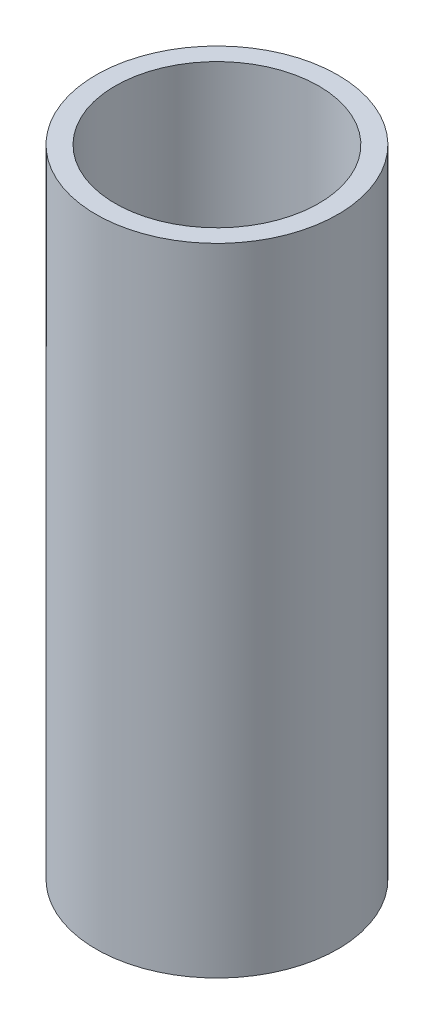
ISO-10303-21;
HEADER;
FILE_DESCRIPTION(('STEP AP214'),'2;1');
FILE_NAME('part.step','',(''),(''),'','','');
FILE_SCHEMA(('AUTOMOTIVE_DESIGN { 1 0 10303 214 1 1 1 1 }'));
ENDSEC;
DATA;
#1=APPLICATION_CONTEXT('core data for automotive mechanical design processes');
#2=APPLICATION_PROTOCOL_DEFINITION('international standard','automotive_design',2000,#1);
#3=PRODUCT_CONTEXT('',#1,'mechanical');
#4=PRODUCT('Part','Part','',(#3));
#5=PRODUCT_RELATED_PRODUCT_CATEGORY('part','',(#4));
#6=PRODUCT_DEFINITION_FORMATION('','',#4);
#7=PRODUCT_DEFINITION_CONTEXT('part definition',#1,'design');
#8=PRODUCT_DEFINITION('design','',#6,#7);
#9=PRODUCT_DEFINITION_SHAPE('','',#8);
#10=(LENGTH_UNIT() NAMED_UNIT(*) SI_UNIT(.MILLI.,.METRE.));
#11=(NAMED_UNIT(*) PLANE_ANGLE_UNIT() SI_UNIT($,.RADIAN.));
#12=(NAMED_UNIT(*) SI_UNIT($,.STERADIAN.) SOLID_ANGLE_UNIT());
#13=UNCERTAINTY_MEASURE_WITH_UNIT(LENGTH_MEASURE(1.E-05),#10,'distance_accuracy_value','');
#14=(GEOMETRIC_REPRESENTATION_CONTEXT(3) GLOBAL_UNCERTAINTY_ASSIGNED_CONTEXT((#13)) GLOBAL_UNIT_ASSIGNED_CONTEXT((#10,
#11,#12)) REPRESENTATION_CONTEXT('',''));
#15=CARTESIAN_POINT('',(0.,0.,0.));
#16=DIRECTION('',(0.,0.,1.));
#17=DIRECTION('',(1.,0.,0.));
#18=AXIS2_PLACEMENT_3D('',#15,#16,#17);
#19=CARTESIAN_POINT('',(-16.,0.,0.));
#20=DIRECTION('',(0.,1.,0.));
#21=DIRECTION('',(0.,0.,1.));
#22=AXIS2_PLACEMENT_3D('',#19,#20,#21);
#23=PLANE('',#22);
#24=CARTESIAN_POINT('',(0.,0.,0.));
#25=DIRECTION('',(0.,-1.,0.));
#26=DIRECTION('',(0.,0.,-1.));
#27=AXIS2_PLACEMENT_3D('',#24,#25,#26);
#28=CIRCLE('',#27,16.);
#29=CARTESIAN_POINT('',(0.,0.,-16.));
#30=VERTEX_POINT('',#29);
#31=EDGE_CURVE('E46',#30,#30,#28,.T.);
#32=ORIENTED_EDGE('',*,*,#31,.F.);
#33=EDGE_LOOP('',(#32));
#34=FACE_BOUND('',#33,.T.);
#35=CARTESIAN_POINT('',(0.,0.,0.));
#36=DIRECTION('',(0.,-1.,0.));
#37=DIRECTION('',(0.,0.,-1.));
#38=AXIS2_PLACEMENT_3D('',#35,#36,#37);
#39=CIRCLE('',#38,19.);
#40=CARTESIAN_POINT('',(0.,0.,-19.));
#41=VERTEX_POINT('',#40);
#42=EDGE_CURVE('E10',#41,#41,#39,.T.);
#43=ORIENTED_EDGE('',*,*,#42,.T.);
#44=EDGE_LOOP('',(#43));
#45=FACE_BOUND('',#44,.T.);
#46=ADVANCED_FACE('F32',(#34,#45),#23,.F.);
#47=CARTESIAN_POINT('',(0.,0.,0.));
#48=DIRECTION('',(0.,-1.,0.));
#49=DIRECTION('',(0.,0.,-1.));
#50=AXIS2_PLACEMENT_3D('',#47,#48,#49);
#51=CYLINDRICAL_SURFACE('',#50,19.);
#52=ORIENTED_EDGE('',*,*,#42,.F.);
#53=EDGE_LOOP('',(#52));
#54=FACE_BOUND('',#53,.T.);
#55=CARTESIAN_POINT('',(0.,100.,0.));
#56=DIRECTION('',(0.,-1.,0.));
#57=DIRECTION('',(0.,0.,-1.));
#58=AXIS2_PLACEMENT_3D('',#55,#56,#57);
#59=CIRCLE('',#58,19.);
#60=CARTESIAN_POINT('',(0.,100.,-19.));
#61=VERTEX_POINT('',#60);
#62=EDGE_CURVE('E38',#61,#61,#59,.T.);
#63=ORIENTED_EDGE('',*,*,#62,.T.);
#64=EDGE_LOOP('',(#63));
#65=FACE_BOUND('',#64,.T.);
#66=ADVANCED_FACE('F55',(#54,#65),#51,.T.);
#67=CARTESIAN_POINT('',(-16.,100.,0.));
#68=DIRECTION('',(0.,-1.,0.));
#69=DIRECTION('',(0.,0.,-1.));
#70=AXIS2_PLACEMENT_3D('',#67,#68,#69);
#71=PLANE('',#70);
#72=ORIENTED_EDGE('',*,*,#62,.F.);
#73=EDGE_LOOP('',(#72));
#74=FACE_BOUND('',#73,.T.);
#75=CARTESIAN_POINT('',(0.,100.,0.));
#76=DIRECTION('',(0.,-1.,0.));
#77=DIRECTION('',(0.,0.,-1.));
#78=AXIS2_PLACEMENT_3D('',#75,#76,#77);
#79=CIRCLE('',#78,16.);
#80=CARTESIAN_POINT('',(0.,100.,-16.));
#81=VERTEX_POINT('',#80);
#82=EDGE_CURVE('E42',#81,#81,#79,.T.);
#83=ORIENTED_EDGE('',*,*,#82,.T.);
#84=EDGE_LOOP('',(#83));
#85=FACE_BOUND('',#84,.T.);
#86=ADVANCED_FACE('F59',(#74,#85),#71,.F.);
#87=CARTESIAN_POINT('',(0.,0.,0.));
#88=DIRECTION('',(0.,-1.,0.));
#89=DIRECTION('',(0.,0.,-1.));
#90=AXIS2_PLACEMENT_3D('',#87,#88,#89);
#91=CYLINDRICAL_SURFACE('',#90,16.);
#92=ORIENTED_EDGE('',*,*,#82,.F.);
#93=EDGE_LOOP('',(#92));
#94=FACE_BOUND('',#93,.T.);
#95=ORIENTED_EDGE('',*,*,#31,.T.);
#96=EDGE_LOOP('',(#95));
#97=FACE_BOUND('',#96,.T.);
#98=ADVANCED_FACE('F52',(#94,#97),#91,.F.);
#99=CLOSED_SHELL('',(#46,#66,#86,#98));
#100=MANIFOLD_SOLID_BREP('B2',#99);
#101=ADVANCED_BREP_SHAPE_REPRESENTATION('',(#18,#100),#14);
#102=SHAPE_DEFINITION_REPRESENTATION(#9,#101);
ENDSEC;
END-ISO-10303-21;
